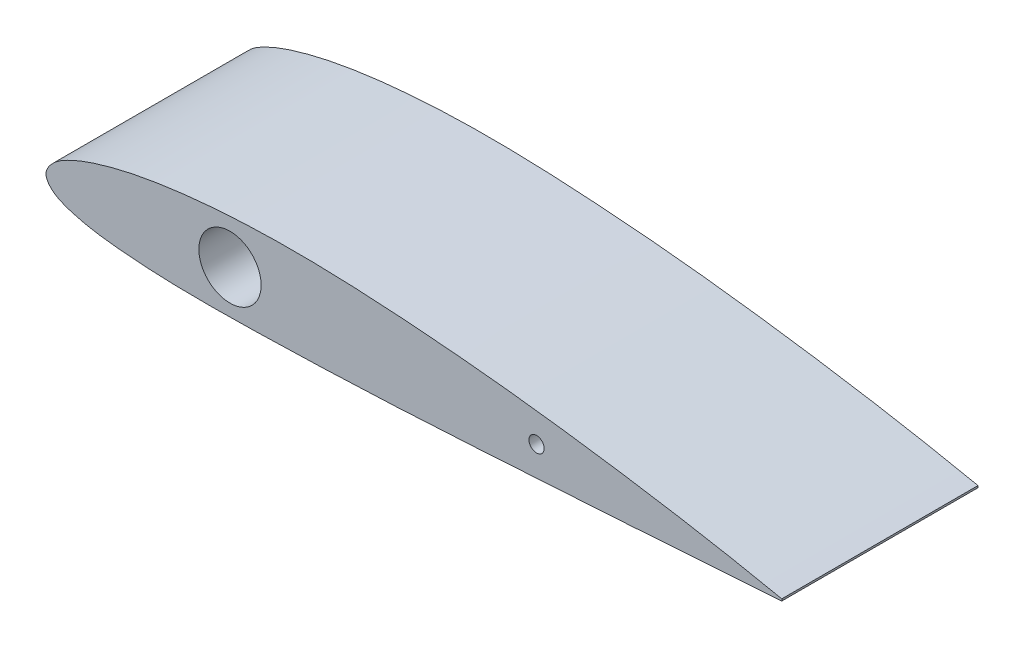
ISO-10303-21;
HEADER;
FILE_DESCRIPTION(('STEP AP214'),'2;1');
FILE_NAME('part.step','',(''),(''),'','','');
FILE_SCHEMA(('AUTOMOTIVE_DESIGN { 1 0 10303 214 1 1 1 1 }'));
ENDSEC;
DATA;
#1=APPLICATION_CONTEXT('core data for automotive mechanical design processes');
#2=APPLICATION_PROTOCOL_DEFINITION('international standard','automotive_design',2000,#1);
#3=PRODUCT_CONTEXT('',#1,'mechanical');
#4=PRODUCT('Part','Part','',(#3));
#5=PRODUCT_RELATED_PRODUCT_CATEGORY('part','',(#4));
#6=PRODUCT_DEFINITION_FORMATION('','',#4);
#7=PRODUCT_DEFINITION_CONTEXT('part definition',#1,'design');
#8=PRODUCT_DEFINITION('design','',#6,#7);
#9=PRODUCT_DEFINITION_SHAPE('','',#8);
#10=(LENGTH_UNIT() NAMED_UNIT(*) SI_UNIT(.MILLI.,.METRE.));
#11=(NAMED_UNIT(*) PLANE_ANGLE_UNIT() SI_UNIT($,.RADIAN.));
#12=(NAMED_UNIT(*) SI_UNIT($,.STERADIAN.) SOLID_ANGLE_UNIT());
#13=UNCERTAINTY_MEASURE_WITH_UNIT(LENGTH_MEASURE(1.E-05),#10,'distance_accuracy_value','');
#14=(GEOMETRIC_REPRESENTATION_CONTEXT(3) GLOBAL_UNCERTAINTY_ASSIGNED_CONTEXT((#13)) GLOBAL_UNIT_ASSIGNED_CONTEXT((#10,
#11,#12)) REPRESENTATION_CONTEXT('',''));
#15=CARTESIAN_POINT('',(0.,0.,0.));
#16=DIRECTION('',(0.,0.,1.));
#17=DIRECTION('',(1.,0.,0.));
#18=AXIS2_PLACEMENT_3D('',#15,#16,#17);
#19=CARTESIAN_POINT('',(240.035038375223,1.97101787544345,350.));
#20=DIRECTION('',(0.,0.,-1.));
#21=DIRECTION('',(-1.,0.,0.));
#22=AXIS2_PLACEMENT_3D('',#19,#20,#21);
#23=PLANE('',#22);
#24=CARTESIAN_POINT('',(539.756063179745,0.39,350.));
#25=CARTESIAN_POINT('',(534.758836377568,1.41400008195598,350.));
#26=CARTESIAN_POINT('',(524.777507596055,3.45931079025678,350.));
#27=CARTESIAN_POINT('',(504.797708887649,7.20557933364791,350.));
#28=CARTESIAN_POINT('',(479.80950222652,11.3564479704612,350.));
#29=CARTESIAN_POINT('',(449.803810027358,15.6524957785908,350.));
#30=CARTESIAN_POINT('',(419.803067523876,19.2352409061205,350.));
#31=CARTESIAN_POINT('',(389.789318532077,21.8585805133964,350.));
#32=CARTESIAN_POINT('',(359.782404697451,23.6350972087243,350.));
#33=CARTESIAN_POINT('',(334.746727737023,23.9358084070618,350.));
#34=CARTESIAN_POINT('',(314.737918653344,23.1074657207402,350.));
#35=CARTESIAN_POINT('',(299.719041415212,21.8937043176695,350.));
#36=CARTESIAN_POINT('',(284.681203013692,19.9716341703371,350.));
#37=CARTESIAN_POINT('',(272.165982385391,17.6047534607132,350.));
#38=CARTESIAN_POINT('',(262.188602891255,14.9269739564241,350.));
#39=CARTESIAN_POINT('',(254.624340154724,12.492476273955,350.));
#40=CARTESIAN_POINT('',(248.215533149548,9.65592082154849,350.));
#41=CARTESIAN_POINT('',(242.68735416688,6.21691110782145,350.));
#42=CARTESIAN_POINT('',(237.866594490936,0.269631353648603,350.));
#43=CARTESIAN_POINT('',(242.874079358851,-4.95792019832836,350.));
#44=CARTESIAN_POINT('',(248.298854955136,-7.34216026562436,350.));
#45=CARTESIAN_POINT('',(254.679466568206,-9.15324348589112,350.));
#46=CARTESIAN_POINT('',(262.218825653313,-10.451795047266,350.));
#47=CARTESIAN_POINT('',(272.236136575411,-11.55996415767,350.));
#48=CARTESIAN_POINT('',(284.7401725413,-12.4129075723057,350.));
#49=CARTESIAN_POINT('',(299.754296801203,-12.7548777124366,350.));
#50=CARTESIAN_POINT('',(314.757705476587,-12.7072230244063,350.));
#51=CARTESIAN_POINT('',(334.759558694851,-12.2657136301745,350.));
#52=CARTESIAN_POINT('',(359.764209214788,-11.47124296675,350.));
#53=CARTESIAN_POINT('',(389.766079926418,-10.0886232457377,350.));
#54=CARTESIAN_POINT('',(419.759251014437,-8.29156110821286,350.));
#55=CARTESIAN_POINT('',(449.757509221983,-6.42365888730463,350.));
#56=CARTESIAN_POINT('',(479.760896614153,-4.53293845373142,350.));
#57=CARTESIAN_POINT('',(504.755492949404,-2.79159322236736,350.));
#58=CARTESIAN_POINT('',(524.757335304591,-1.44846177238625,350.));
#59=CARTESIAN_POINT('',(534.756258336081,-0.742836743253159,350.));
#60=CARTESIAN_POINT('',(539.756063179745,-0.39,350.));
#61=B_SPLINE_CURVE_WITH_KNOTS('',3,(#24,#25,#26,#27,#28,#29,#30,#31,#32,#33,#34,#35,#36,#37,#38,
#39,#40,#41,#42,#43,#44,#45,#46,#47,#48,#49,#50,#51,#52,#53,#54,#55,#56,#57,#58,#59,#60),
.UNSPECIFIED.,.F.,.F.,(4,1,1,1,1,1,1,1,1,1,1,1,1,1,1,1,1,1,1,1,1,1,1,1,1,1,1,1,1,1,1,1,1,1,4),
(0.,0.0250124897498648,0.0499592861642578,0.0996729249269685,0.149206319909966,
0.198581096615965,0.247805170456832,0.296916574601493,0.345952721793533,0.37049162556991,
0.395091203654929,0.41981479582396,0.444798575016595,0.457489818915221,0.470406405435489,
0.483879408669829,0.491264120322896,0.503458853294664,0.513609129403887,0.520450990700287,
0.533235387615153,0.545691039147803,0.558031884237173,0.582609167247894,0.607134741746914,
0.631652079836766,0.656174271859652,0.705233949250519,0.754320378530032,0.803437363555032,
0.852566095729537,0.901700994033254,0.95084880933727,0.975422716989278,1.),.UNSPECIFIED.);
#62=CARTESIAN_POINT('',(539.756063179745,0.39,350.));
#63=VERTEX_POINT('',#62);
#64=CARTESIAN_POINT('',(539.756063179745,-0.39,350.));
#65=VERTEX_POINT('',#64);
#66=EDGE_CURVE('E79',#63,#65,#61,.T.);
#67=ORIENTED_EDGE('',*,*,#66,.T.);
#68=DIRECTION('',(0.,1.,0.));
#69=VECTOR('',#68,1.);
#70=CARTESIAN_POINT('',(539.756063179745,0.39,350.));
#71=LINE('',#70,#69);
#72=EDGE_CURVE('E63',#65,#63,#71,.T.);
#73=ORIENTED_EDGE('',*,*,#72,.T.);
#74=EDGE_LOOP('',(#67,#73));
#75=FACE_BOUND('',#74,.T.);
#76=CARTESIAN_POINT('',(439.756063179745,5.,350.));
#77=DIRECTION('',(0.,0.,1.));
#78=DIRECTION('',(1.,0.,0.));
#79=AXIS2_PLACEMENT_3D('',#76,#77,#78);
#80=CIRCLE('',#79,3.09999999999999);
#81=CARTESIAN_POINT('',(442.856063179745,5.,350.));
#82=VERTEX_POINT('',#81);
#83=EDGE_CURVE('E87',#82,#82,#80,.T.);
#84=ORIENTED_EDGE('',*,*,#83,.F.);
#85=EDGE_LOOP('',(#84));
#86=FACE_BOUND('',#85,.T.);
#87=CARTESIAN_POINT('',(314.756063179745,5.,350.));
#88=DIRECTION('',(0.,0.,1.));
#89=DIRECTION('',(1.,0.,0.));
#90=AXIS2_PLACEMENT_3D('',#87,#88,#89);
#91=CIRCLE('',#90,12.7);
#92=CARTESIAN_POINT('',(327.456063179745,5.,350.));
#93=VERTEX_POINT('',#92);
#94=EDGE_CURVE('E110',#93,#93,#91,.T.);
#95=ORIENTED_EDGE('',*,*,#94,.F.);
#96=EDGE_LOOP('',(#95));
#97=FACE_BOUND('',#96,.T.);
#98=ADVANCED_FACE('F45',(#75,#86,#97),#23,.F.);
#99=CARTESIAN_POINT('',(240.035038375223,1.97101787544345,270.));
#100=DIRECTION('',(0.,0.,-1.));
#101=DIRECTION('',(-1.,0.,0.));
#102=AXIS2_PLACEMENT_3D('',#99,#100,#101);
#103=PLANE('',#102);
#104=CARTESIAN_POINT('',(439.756063179745,5.,270.));
#105=DIRECTION('',(0.,0.,1.));
#106=DIRECTION('',(1.,0.,0.));
#107=AXIS2_PLACEMENT_3D('',#104,#105,#106);
#108=CIRCLE('',#107,3.09999999999999);
#109=CARTESIAN_POINT('',(442.856063179745,5.,270.));
#110=VERTEX_POINT('',#109);
#111=EDGE_CURVE('E91',#110,#110,#108,.T.);
#112=ORIENTED_EDGE('',*,*,#111,.T.);
#113=EDGE_LOOP('',(#112));
#114=FACE_BOUND('',#113,.T.);
#115=CARTESIAN_POINT('',(539.756063179745,0.39,270.));
#116=CARTESIAN_POINT('',(534.758836377568,1.41400008195598,270.));
#117=CARTESIAN_POINT('',(524.777507596055,3.45931079025678,270.));
#118=CARTESIAN_POINT('',(504.797708887649,7.20557933364791,270.));
#119=CARTESIAN_POINT('',(479.80950222652,11.3564479704612,270.));
#120=CARTESIAN_POINT('',(449.803810027358,15.6524957785908,270.));
#121=CARTESIAN_POINT('',(419.803067523876,19.2352409061205,270.));
#122=CARTESIAN_POINT('',(389.789318532077,21.8585805133964,270.));
#123=CARTESIAN_POINT('',(359.782404697451,23.6350972087243,270.));
#124=CARTESIAN_POINT('',(334.746727737023,23.9358084070618,270.));
#125=CARTESIAN_POINT('',(314.737918653344,23.1074657207402,270.));
#126=CARTESIAN_POINT('',(299.719041415212,21.8937043176695,270.));
#127=CARTESIAN_POINT('',(284.681203013692,19.9716341703371,270.));
#128=CARTESIAN_POINT('',(272.165982385391,17.6047534607132,270.));
#129=CARTESIAN_POINT('',(262.188602891255,14.9269739564241,270.));
#130=CARTESIAN_POINT('',(254.624340154724,12.492476273955,270.));
#131=CARTESIAN_POINT('',(248.215533149548,9.65592082154849,270.));
#132=CARTESIAN_POINT('',(242.68735416688,6.21691110782145,270.));
#133=CARTESIAN_POINT('',(237.866594490936,0.269631353648603,270.));
#134=CARTESIAN_POINT('',(242.874079358851,-4.95792019832836,270.));
#135=CARTESIAN_POINT('',(248.298854955136,-7.34216026562436,270.));
#136=CARTESIAN_POINT('',(254.679466568206,-9.15324348589112,270.));
#137=CARTESIAN_POINT('',(262.218825653313,-10.451795047266,270.));
#138=CARTESIAN_POINT('',(272.236136575411,-11.55996415767,270.));
#139=CARTESIAN_POINT('',(284.7401725413,-12.4129075723057,270.));
#140=CARTESIAN_POINT('',(299.754296801203,-12.7548777124366,270.));
#141=CARTESIAN_POINT('',(314.757705476587,-12.7072230244063,270.));
#142=CARTESIAN_POINT('',(334.759558694851,-12.2657136301745,270.));
#143=CARTESIAN_POINT('',(359.764209214788,-11.47124296675,270.));
#144=CARTESIAN_POINT('',(389.766079926418,-10.0886232457377,270.));
#145=CARTESIAN_POINT('',(419.759251014437,-8.29156110821286,270.));
#146=CARTESIAN_POINT('',(449.757509221983,-6.42365888730463,270.));
#147=CARTESIAN_POINT('',(479.760896614153,-4.53293845373142,270.));
#148=CARTESIAN_POINT('',(504.755492949404,-2.79159322236736,270.));
#149=CARTESIAN_POINT('',(524.757335304591,-1.44846177238625,270.));
#150=CARTESIAN_POINT('',(534.756258336081,-0.742836743253159,270.));
#151=CARTESIAN_POINT('',(539.756063179745,-0.39,270.));
#152=B_SPLINE_CURVE_WITH_KNOTS('',3,(#115,#116,#117,#118,#119,#120,#121,#122,#123,#124,#125,
#126,#127,#128,#129,#130,#131,#132,#133,#134,#135,#136,#137,#138,#139,#140,#141,#142,#143,#144,
#145,#146,#147,#148,#149,#150,#151),.UNSPECIFIED.,.F.,.F.,(4,1,1,1,1,1,1,1,1,1,1,1,1,1,1,1,1,1,
1,1,1,1,1,1,1,1,1,1,1,1,1,1,1,1,4),(0.,0.0250124897498648,0.0499592861642578,0.0996729249269685,
0.149206319909966,0.198581096615965,0.247805170456832,0.296916574601493,0.345952721793533,
0.37049162556991,0.395091203654929,0.41981479582396,0.444798575016595,0.457489818915221,
0.470406405435489,0.483879408669829,0.491264120322896,0.503458853294664,0.513609129403887,
0.520450990700287,0.533235387615153,0.545691039147803,0.558031884237173,0.582609167247894,
0.607134741746914,0.631652079836766,0.656174271859652,0.705233949250519,0.754320378530032,
0.803437363555032,0.852566095729537,0.901700994033254,0.95084880933727,0.975422716989278,1.),.UNSPECIFIED.);
#153=CARTESIAN_POINT('',(539.756063179745,0.39,270.));
#154=VERTEX_POINT('',#153);
#155=CARTESIAN_POINT('',(539.756063179745,-0.39,270.));
#156=VERTEX_POINT('',#155);
#157=EDGE_CURVE('E80',#154,#156,#152,.T.);
#158=ORIENTED_EDGE('',*,*,#157,.F.);
#159=DIRECTION('',(0.,1.,0.));
#160=VECTOR('',#159,1.);
#161=CARTESIAN_POINT('',(539.756063179745,0.39,270.));
#162=LINE('',#161,#160);
#163=EDGE_CURVE('E71',#156,#154,#162,.T.);
#164=ORIENTED_EDGE('',*,*,#163,.F.);
#165=EDGE_LOOP('',(#158,#164));
#166=FACE_BOUND('',#165,.T.);
#167=CARTESIAN_POINT('',(314.756063179745,5.,270.));
#168=DIRECTION('',(0.,0.,1.));
#169=DIRECTION('',(1.,0.,0.));
#170=AXIS2_PLACEMENT_3D('',#167,#168,#169);
#171=CIRCLE('',#170,12.7);
#172=CARTESIAN_POINT('',(327.456063179745,5.,270.));
#173=VERTEX_POINT('',#172);
#174=EDGE_CURVE('E112',#173,#173,#171,.T.);
#175=ORIENTED_EDGE('',*,*,#174,.T.);
#176=EDGE_LOOP('',(#175));
#177=FACE_BOUND('',#176,.T.);
#178=ADVANCED_FACE('F84',(#114,#166,#177),#103,.T.);
#179=DIRECTION('',(0.,0.,-1.));
#180=VECTOR('',#179,1.);
#181=SURFACE_OF_LINEAR_EXTRUSION('',#61,#180);
#182=ORIENTED_EDGE('',*,*,#157,.T.);
#183=DIRECTION('',(0.,0.,-1.));
#184=VECTOR('',#183,1.);
#185=CARTESIAN_POINT('',(539.756063179745,-0.39,350.));
#186=LINE('',#185,#184);
#187=EDGE_CURVE('E11',#65,#156,#186,.T.);
#188=ORIENTED_EDGE('',*,*,#187,.F.);
#189=ORIENTED_EDGE('',*,*,#66,.F.);
#190=DIRECTION('',(0.,0.,-1.));
#191=VECTOR('',#190,1.);
#192=CARTESIAN_POINT('',(539.756063179745,0.39,350.));
#193=LINE('',#192,#191);
#194=EDGE_CURVE('E56',#63,#154,#193,.T.);
#195=ORIENTED_EDGE('',*,*,#194,.T.);
#196=EDGE_LOOP('',(#182,#188,#189,#195));
#197=FACE_BOUND('',#196,.T.);
#198=ADVANCED_FACE('F47',(#197),#181,.F.);
#199=CARTESIAN_POINT('',(539.756063179745,0.39,350.));
#200=DIRECTION('',(-1.,0.,0.));
#201=DIRECTION('',(0.,-1.,0.));
#202=AXIS2_PLACEMENT_3D('',#199,#200,#201);
#203=PLANE('',#202);
#204=ORIENTED_EDGE('',*,*,#163,.T.);
#205=ORIENTED_EDGE('',*,*,#194,.F.);
#206=ORIENTED_EDGE('',*,*,#72,.F.);
#207=ORIENTED_EDGE('',*,*,#187,.T.);
#208=EDGE_LOOP('',(#204,#205,#206,#207));
#209=FACE_BOUND('',#208,.T.);
#210=ADVANCED_FACE('F74',(#209),#203,.F.);
#211=CARTESIAN_POINT('',(439.756063179745,5.,350.));
#212=DIRECTION('',(0.,0.,-1.));
#213=DIRECTION('',(-1.,0.,0.));
#214=AXIS2_PLACEMENT_3D('',#211,#212,#213);
#215=CYLINDRICAL_SURFACE('',#214,3.09999999999999);
#216=ORIENTED_EDGE('',*,*,#83,.T.);
#217=EDGE_LOOP('',(#216));
#218=FACE_BOUND('',#217,.T.);
#219=ORIENTED_EDGE('',*,*,#111,.F.);
#220=EDGE_LOOP('',(#219));
#221=FACE_BOUND('',#220,.T.);
#222=ADVANCED_FACE('F132',(#218,#221),#215,.F.);
#223=CARTESIAN_POINT('',(314.756063179745,5.,350.));
#224=DIRECTION('',(0.,0.,-1.));
#225=DIRECTION('',(-1.,0.,0.));
#226=AXIS2_PLACEMENT_3D('',#223,#224,#225);
#227=CYLINDRICAL_SURFACE('',#226,12.7);
#228=ORIENTED_EDGE('',*,*,#94,.T.);
#229=EDGE_LOOP('',(#228));
#230=FACE_BOUND('',#229,.T.);
#231=ORIENTED_EDGE('',*,*,#174,.F.);
#232=EDGE_LOOP('',(#231));
#233=FACE_BOUND('',#232,.T.);
#234=ADVANCED_FACE('F120',(#230,#233),#227,.F.);
#235=CLOSED_SHELL('',(#98,#178,#198,#210,#222,#234));
#236=MANIFOLD_SOLID_BREP('B2',#235);
#237=ADVANCED_BREP_SHAPE_REPRESENTATION('',(#18,#236),#14);
#238=SHAPE_DEFINITION_REPRESENTATION(#9,#237);
ENDSEC;
END-ISO-10303-21;
